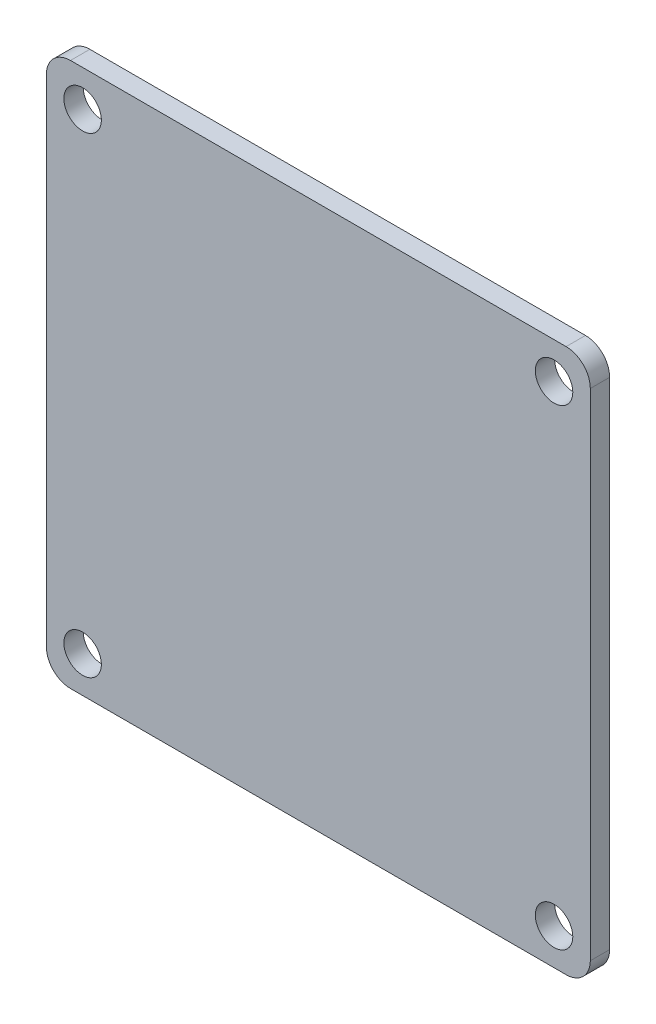
ISO-10303-21;
HEADER;
FILE_DESCRIPTION(('STEP AP214'),'2;1');
FILE_NAME('part.step','',(''),(''),'','','');
FILE_SCHEMA(('AUTOMOTIVE_DESIGN { 1 0 10303 214 1 1 1 1 }'));
ENDSEC;
DATA;
#1=APPLICATION_CONTEXT('core data for automotive mechanical design processes');
#2=APPLICATION_PROTOCOL_DEFINITION('international standard','automotive_design',2000,#1);
#3=PRODUCT_CONTEXT('',#1,'mechanical');
#4=PRODUCT('Part','Part','',(#3));
#5=PRODUCT_RELATED_PRODUCT_CATEGORY('part','',(#4));
#6=PRODUCT_DEFINITION_FORMATION('','',#4);
#7=PRODUCT_DEFINITION_CONTEXT('part definition',#1,'design');
#8=PRODUCT_DEFINITION('design','',#6,#7);
#9=PRODUCT_DEFINITION_SHAPE('','',#8);
#10=(LENGTH_UNIT() NAMED_UNIT(*) SI_UNIT(.MILLI.,.METRE.));
#11=(NAMED_UNIT(*) PLANE_ANGLE_UNIT() SI_UNIT($,.RADIAN.));
#12=(NAMED_UNIT(*) SI_UNIT($,.STERADIAN.) SOLID_ANGLE_UNIT());
#13=UNCERTAINTY_MEASURE_WITH_UNIT(LENGTH_MEASURE(1.E-05),#10,'distance_accuracy_value','');
#14=(GEOMETRIC_REPRESENTATION_CONTEXT(3) GLOBAL_UNCERTAINTY_ASSIGNED_CONTEXT((#13)) GLOBAL_UNIT_ASSIGNED_CONTEXT((#10,
#11,#12)) REPRESENTATION_CONTEXT('',''));
#15=CARTESIAN_POINT('',(0.,0.,0.));
#16=DIRECTION('',(0.,0.,1.));
#17=DIRECTION('',(1.,0.,0.));
#18=AXIS2_PLACEMENT_3D('',#15,#16,#17);
#19=CARTESIAN_POINT('',(0.,0.,1.6));
#20=DIRECTION('',(0.,0.,-1.));
#21=DIRECTION('',(-1.,0.,0.));
#22=AXIS2_PLACEMENT_3D('',#19,#20,#21);
#23=PLANE('',#22);
#24=DIRECTION('',(-1.,0.,0.));
#25=VECTOR('',#24,1.);
#26=CARTESIAN_POINT('',(0.,45.,1.6));
#27=LINE('',#26,#25);
#28=CARTESIAN_POINT('',(43.,45.,1.6));
#29=VERTEX_POINT('',#28);
#30=CARTESIAN_POINT('',(1.99999999999999,45.,1.6));
#31=VERTEX_POINT('',#30);
#32=EDGE_CURVE('E136',#29,#31,#27,.T.);
#33=ORIENTED_EDGE('',*,*,#32,.T.);
#34=CARTESIAN_POINT('',(1.99999999999999,43.,1.6));
#35=DIRECTION('',(0.,0.,-1.));
#36=DIRECTION('',(-1.,0.,0.));
#37=AXIS2_PLACEMENT_3D('',#34,#35,#36);
#38=CIRCLE('',#37,2.);
#39=CARTESIAN_POINT('',(0.,43.,1.6));
#40=VERTEX_POINT('',#39);
#41=EDGE_CURVE('E155',#31,#40,#38,.F.);
#42=ORIENTED_EDGE('',*,*,#41,.T.);
#43=DIRECTION('',(0.,-1.,0.));
#44=VECTOR('',#43,1.);
#45=CARTESIAN_POINT('',(0.,0.,1.6));
#46=LINE('',#45,#44);
#47=CARTESIAN_POINT('',(0.,2.,1.6));
#48=VERTEX_POINT('',#47);
#49=EDGE_CURVE('E119',#40,#48,#46,.T.);
#50=ORIENTED_EDGE('',*,*,#49,.T.);
#51=CARTESIAN_POINT('',(2.,2.,1.6));
#52=DIRECTION('',(0.,0.,-1.));
#53=DIRECTION('',(-1.,0.,0.));
#54=AXIS2_PLACEMENT_3D('',#51,#52,#53);
#55=CIRCLE('',#54,2.);
#56=CARTESIAN_POINT('',(2.,0.,1.6));
#57=VERTEX_POINT('',#56);
#58=EDGE_CURVE('E150',#48,#57,#55,.F.);
#59=ORIENTED_EDGE('',*,*,#58,.T.);
#60=DIRECTION('',(1.,0.,0.));
#61=VECTOR('',#60,1.);
#62=CARTESIAN_POINT('',(0.,0.,1.6));
#63=LINE('',#62,#61);
#64=CARTESIAN_POINT('',(43.,0.,1.6));
#65=VERTEX_POINT('',#64);
#66=EDGE_CURVE('E166',#57,#65,#63,.T.);
#67=ORIENTED_EDGE('',*,*,#66,.T.);
#68=CARTESIAN_POINT('',(43.,2.,1.6));
#69=DIRECTION('',(0.,0.,-1.));
#70=DIRECTION('',(-1.,0.,0.));
#71=AXIS2_PLACEMENT_3D('',#68,#69,#70);
#72=CIRCLE('',#71,2.);
#73=CARTESIAN_POINT('',(45.,2.,1.6));
#74=VERTEX_POINT('',#73);
#75=EDGE_CURVE('E55',#65,#74,#72,.F.);
#76=ORIENTED_EDGE('',*,*,#75,.T.);
#77=DIRECTION('',(0.,1.,0.));
#78=VECTOR('',#77,1.);
#79=CARTESIAN_POINT('',(45.,0.,1.6));
#80=LINE('',#79,#78);
#81=CARTESIAN_POINT('',(45.,43.,1.6));
#82=VERTEX_POINT('',#81);
#83=EDGE_CURVE('E174',#74,#82,#80,.T.);
#84=ORIENTED_EDGE('',*,*,#83,.T.);
#85=CARTESIAN_POINT('',(43.,43.,1.6));
#86=DIRECTION('',(0.,0.,-1.));
#87=DIRECTION('',(-1.,0.,0.));
#88=AXIS2_PLACEMENT_3D('',#85,#86,#87);
#89=CIRCLE('',#88,2.);
#90=EDGE_CURVE('E153',#82,#29,#89,.F.);
#91=ORIENTED_EDGE('',*,*,#90,.T.);
#92=EDGE_LOOP('',(#33,#42,#50,#59,#67,#76,#84,#91));
#93=FACE_BOUND('',#92,.T.);
#94=CARTESIAN_POINT('',(3.,42.,1.6));
#95=DIRECTION('',(0.,0.,1.));
#96=DIRECTION('',(1.,0.,0.));
#97=AXIS2_PLACEMENT_3D('',#94,#95,#96);
#98=CIRCLE('',#97,1.55000000000001);
#99=CARTESIAN_POINT('',(4.55000000000001,42.,1.6));
#100=VERTEX_POINT('',#99);
#101=EDGE_CURVE('E127',#100,#100,#98,.T.);
#102=ORIENTED_EDGE('',*,*,#101,.F.);
#103=EDGE_LOOP('',(#102));
#104=FACE_BOUND('',#103,.T.);
#105=CARTESIAN_POINT('',(42.,42.,1.6));
#106=DIRECTION('',(0.,0.,1.));
#107=DIRECTION('',(1.,0.,0.));
#108=AXIS2_PLACEMENT_3D('',#105,#106,#107);
#109=CIRCLE('',#108,1.55);
#110=CARTESIAN_POINT('',(43.55,42.,1.6));
#111=VERTEX_POINT('',#110);
#112=EDGE_CURVE('E181',#111,#111,#109,.T.);
#113=ORIENTED_EDGE('',*,*,#112,.F.);
#114=EDGE_LOOP('',(#113));
#115=FACE_BOUND('',#114,.T.);
#116=CARTESIAN_POINT('',(42.,3.,1.6));
#117=DIRECTION('',(0.,0.,1.));
#118=DIRECTION('',(1.,0.,0.));
#119=AXIS2_PLACEMENT_3D('',#116,#117,#118);
#120=CIRCLE('',#119,1.55);
#121=CARTESIAN_POINT('',(43.55,3.,1.6));
#122=VERTEX_POINT('',#121);
#123=EDGE_CURVE('E186',#122,#122,#120,.T.);
#124=ORIENTED_EDGE('',*,*,#123,.F.);
#125=EDGE_LOOP('',(#124));
#126=FACE_BOUND('',#125,.T.);
#127=CARTESIAN_POINT('',(3.,3.,1.6));
#128=DIRECTION('',(0.,0.,1.));
#129=DIRECTION('',(1.,0.,0.));
#130=AXIS2_PLACEMENT_3D('',#127,#128,#129);
#131=CIRCLE('',#130,1.55);
#132=CARTESIAN_POINT('',(4.55,3.,1.6));
#133=VERTEX_POINT('',#132);
#134=EDGE_CURVE('E192',#133,#133,#131,.T.);
#135=ORIENTED_EDGE('',*,*,#134,.F.);
#136=EDGE_LOOP('',(#135));
#137=FACE_BOUND('',#136,.T.);
#138=ADVANCED_FACE('F33',(#93,#104,#115,#126,#137),#23,.F.);
#139=CARTESIAN_POINT('',(0.,0.,0.));
#140=DIRECTION('',(0.,0.,-1.));
#141=DIRECTION('',(-1.,0.,0.));
#142=AXIS2_PLACEMENT_3D('',#139,#140,#141);
#143=PLANE('',#142);
#144=CARTESIAN_POINT('',(42.,3.,0.));
#145=DIRECTION('',(0.,0.,1.));
#146=DIRECTION('',(1.,0.,0.));
#147=AXIS2_PLACEMENT_3D('',#144,#145,#146);
#148=CIRCLE('',#147,1.55);
#149=CARTESIAN_POINT('',(43.55,3.,0.));
#150=VERTEX_POINT('',#149);
#151=EDGE_CURVE('E189',#150,#150,#148,.T.);
#152=ORIENTED_EDGE('',*,*,#151,.T.);
#153=EDGE_LOOP('',(#152));
#154=FACE_BOUND('',#153,.T.);
#155=CARTESIAN_POINT('',(3.,42.,0.));
#156=DIRECTION('',(0.,0.,1.));
#157=DIRECTION('',(1.,0.,0.));
#158=AXIS2_PLACEMENT_3D('',#155,#156,#157);
#159=CIRCLE('',#158,1.55000000000001);
#160=CARTESIAN_POINT('',(4.55000000000001,42.,0.));
#161=VERTEX_POINT('',#160);
#162=EDGE_CURVE('E133',#161,#161,#159,.T.);
#163=ORIENTED_EDGE('',*,*,#162,.T.);
#164=EDGE_LOOP('',(#163));
#165=FACE_BOUND('',#164,.T.);
#166=DIRECTION('',(0.,-1.,0.));
#167=VECTOR('',#166,1.);
#168=CARTESIAN_POINT('',(0.,0.,0.));
#169=LINE('',#168,#167);
#170=CARTESIAN_POINT('',(0.,43.,0.));
#171=VERTEX_POINT('',#170);
#172=CARTESIAN_POINT('',(0.,2.,0.));
#173=VERTEX_POINT('',#172);
#174=EDGE_CURVE('E116',#171,#173,#169,.T.);
#175=ORIENTED_EDGE('',*,*,#174,.F.);
#176=CARTESIAN_POINT('',(1.99999999999999,43.,0.));
#177=DIRECTION('',(0.,0.,-1.));
#178=DIRECTION('',(-1.,0.,0.));
#179=AXIS2_PLACEMENT_3D('',#176,#177,#178);
#180=CIRCLE('',#179,2.);
#181=CARTESIAN_POINT('',(1.99999999999999,45.,0.));
#182=VERTEX_POINT('',#181);
#183=EDGE_CURVE('E99',#171,#182,#180,.T.);
#184=ORIENTED_EDGE('',*,*,#183,.T.);
#185=DIRECTION('',(-1.,0.,0.));
#186=VECTOR('',#185,1.);
#187=CARTESIAN_POINT('',(0.,45.,0.));
#188=LINE('',#187,#186);
#189=CARTESIAN_POINT('',(43.,45.,0.));
#190=VERTEX_POINT('',#189);
#191=EDGE_CURVE('E140',#190,#182,#188,.T.);
#192=ORIENTED_EDGE('',*,*,#191,.F.);
#193=CARTESIAN_POINT('',(43.,43.,0.));
#194=DIRECTION('',(0.,0.,-1.));
#195=DIRECTION('',(-1.,0.,0.));
#196=AXIS2_PLACEMENT_3D('',#193,#194,#195);
#197=CIRCLE('',#196,2.);
#198=CARTESIAN_POINT('',(45.,43.,0.));
#199=VERTEX_POINT('',#198);
#200=EDGE_CURVE('E110',#190,#199,#197,.T.);
#201=ORIENTED_EDGE('',*,*,#200,.T.);
#202=DIRECTION('',(0.,1.,0.));
#203=VECTOR('',#202,1.);
#204=CARTESIAN_POINT('',(45.,0.,0.));
#205=LINE('',#204,#203);
#206=CARTESIAN_POINT('',(45.,2.,0.));
#207=VERTEX_POINT('',#206);
#208=EDGE_CURVE('E130',#207,#199,#205,.T.);
#209=ORIENTED_EDGE('',*,*,#208,.F.);
#210=CARTESIAN_POINT('',(43.,2.,0.));
#211=DIRECTION('',(0.,0.,-1.));
#212=DIRECTION('',(-1.,0.,0.));
#213=AXIS2_PLACEMENT_3D('',#210,#211,#212);
#214=CIRCLE('',#213,2.);
#215=CARTESIAN_POINT('',(43.,0.,0.));
#216=VERTEX_POINT('',#215);
#217=EDGE_CURVE('E144',#207,#216,#214,.T.);
#218=ORIENTED_EDGE('',*,*,#217,.T.);
#219=DIRECTION('',(1.,0.,0.));
#220=VECTOR('',#219,1.);
#221=CARTESIAN_POINT('',(0.,0.,0.));
#222=LINE('',#221,#220);
#223=CARTESIAN_POINT('',(2.,0.,0.));
#224=VERTEX_POINT('',#223);
#225=EDGE_CURVE('E126',#224,#216,#222,.T.);
#226=ORIENTED_EDGE('',*,*,#225,.F.);
#227=CARTESIAN_POINT('',(2.,2.,0.));
#228=DIRECTION('',(0.,0.,-1.));
#229=DIRECTION('',(-1.,0.,0.));
#230=AXIS2_PLACEMENT_3D('',#227,#228,#229);
#231=CIRCLE('',#230,2.);
#232=EDGE_CURVE('E120',#224,#173,#231,.T.);
#233=ORIENTED_EDGE('',*,*,#232,.T.);
#234=EDGE_LOOP('',(#175,#184,#192,#201,#209,#218,#226,#233));
#235=FACE_BOUND('',#234,.T.);
#236=CARTESIAN_POINT('',(42.,42.,0.));
#237=DIRECTION('',(0.,0.,1.));
#238=DIRECTION('',(1.,0.,0.));
#239=AXIS2_PLACEMENT_3D('',#236,#237,#238);
#240=CIRCLE('',#239,1.55);
#241=CARTESIAN_POINT('',(43.55,42.,0.));
#242=VERTEX_POINT('',#241);
#243=EDGE_CURVE('E183',#242,#242,#240,.T.);
#244=ORIENTED_EDGE('',*,*,#243,.T.);
#245=EDGE_LOOP('',(#244));
#246=FACE_BOUND('',#245,.T.);
#247=CARTESIAN_POINT('',(3.,3.,0.));
#248=DIRECTION('',(0.,0.,1.));
#249=DIRECTION('',(1.,0.,0.));
#250=AXIS2_PLACEMENT_3D('',#247,#248,#249);
#251=CIRCLE('',#250,1.55);
#252=CARTESIAN_POINT('',(4.55,3.,0.));
#253=VERTEX_POINT('',#252);
#254=EDGE_CURVE('E195',#253,#253,#251,.T.);
#255=ORIENTED_EDGE('',*,*,#254,.T.);
#256=EDGE_LOOP('',(#255));
#257=FACE_BOUND('',#256,.T.);
#258=ADVANCED_FACE('F123',(#154,#165,#235,#246,#257),#143,.T.);
#259=CARTESIAN_POINT('',(0.,0.,1.6));
#260=DIRECTION('',(1.,0.,0.));
#261=DIRECTION('',(0.,1.,0.));
#262=AXIS2_PLACEMENT_3D('',#259,#260,#261);
#263=PLANE('',#262);
#264=ORIENTED_EDGE('',*,*,#49,.F.);
#265=DIRECTION('',(0.,0.,-1.));
#266=VECTOR('',#265,1.);
#267=CARTESIAN_POINT('',(0.,43.,1.6));
#268=LINE('',#267,#266);
#269=EDGE_CURVE('E103',#40,#171,#268,.T.);
#270=ORIENTED_EDGE('',*,*,#269,.T.);
#271=ORIENTED_EDGE('',*,*,#174,.T.);
#272=DIRECTION('',(0.,0.,-1.));
#273=VECTOR('',#272,1.);
#274=CARTESIAN_POINT('',(0.,2.,1.6));
#275=LINE('',#274,#273);
#276=EDGE_CURVE('E121',#173,#48,#275,.F.);
#277=ORIENTED_EDGE('',*,*,#276,.T.);
#278=EDGE_LOOP('',(#264,#270,#271,#277));
#279=FACE_BOUND('',#278,.T.);
#280=ADVANCED_FACE('F115',(#279),#263,.F.);
#281=CARTESIAN_POINT('',(0.,0.,1.6));
#282=DIRECTION('',(0.,1.,0.));
#283=DIRECTION('',(0.,0.,1.));
#284=AXIS2_PLACEMENT_3D('',#281,#282,#283);
#285=PLANE('',#284);
#286=ORIENTED_EDGE('',*,*,#225,.T.);
#287=DIRECTION('',(0.,0.,-1.));
#288=VECTOR('',#287,1.);
#289=CARTESIAN_POINT('',(43.,0.,1.6));
#290=LINE('',#289,#288);
#291=EDGE_CURVE('E11',#216,#65,#290,.F.);
#292=ORIENTED_EDGE('',*,*,#291,.T.);
#293=ORIENTED_EDGE('',*,*,#66,.F.);
#294=DIRECTION('',(0.,0.,-1.));
#295=VECTOR('',#294,1.);
#296=CARTESIAN_POINT('',(2.,0.,1.6));
#297=LINE('',#296,#295);
#298=EDGE_CURVE('E41',#57,#224,#297,.T.);
#299=ORIENTED_EDGE('',*,*,#298,.T.);
#300=EDGE_LOOP('',(#286,#292,#293,#299));
#301=FACE_BOUND('',#300,.T.);
#302=ADVANCED_FACE('F164',(#301),#285,.F.);
#303=CARTESIAN_POINT('',(45.,0.,1.6));
#304=DIRECTION('',(-1.,0.,0.));
#305=DIRECTION('',(0.,-1.,0.));
#306=AXIS2_PLACEMENT_3D('',#303,#304,#305);
#307=PLANE('',#306);
#308=ORIENTED_EDGE('',*,*,#208,.T.);
#309=DIRECTION('',(0.,0.,-1.));
#310=VECTOR('',#309,1.);
#311=CARTESIAN_POINT('',(45.,43.,1.6));
#312=LINE('',#311,#310);
#313=EDGE_CURVE('E48',#199,#82,#312,.F.);
#314=ORIENTED_EDGE('',*,*,#313,.T.);
#315=ORIENTED_EDGE('',*,*,#83,.F.);
#316=DIRECTION('',(0.,0.,-1.));
#317=VECTOR('',#316,1.);
#318=CARTESIAN_POINT('',(45.,2.,1.6));
#319=LINE('',#318,#317);
#320=EDGE_CURVE('E157',#74,#207,#319,.T.);
#321=ORIENTED_EDGE('',*,*,#320,.T.);
#322=EDGE_LOOP('',(#308,#314,#315,#321));
#323=FACE_BOUND('',#322,.T.);
#324=ADVANCED_FACE('F173',(#323),#307,.F.);
#325=CARTESIAN_POINT('',(0.,45.,1.6));
#326=DIRECTION('',(0.,-1.,0.));
#327=DIRECTION('',(0.,0.,-1.));
#328=AXIS2_PLACEMENT_3D('',#325,#326,#327);
#329=PLANE('',#328);
#330=ORIENTED_EDGE('',*,*,#191,.T.);
#331=DIRECTION('',(0.,0.,-1.));
#332=VECTOR('',#331,1.);
#333=CARTESIAN_POINT('',(1.99999999999999,45.,1.6));
#334=LINE('',#333,#332);
#335=EDGE_CURVE('E104',#182,#31,#334,.F.);
#336=ORIENTED_EDGE('',*,*,#335,.T.);
#337=ORIENTED_EDGE('',*,*,#32,.F.);
#338=DIRECTION('',(0.,0.,-1.));
#339=VECTOR('',#338,1.);
#340=CARTESIAN_POINT('',(43.,45.,1.6));
#341=LINE('',#340,#339);
#342=EDGE_CURVE('E109',#29,#190,#341,.T.);
#343=ORIENTED_EDGE('',*,*,#342,.T.);
#344=EDGE_LOOP('',(#330,#336,#337,#343));
#345=FACE_BOUND('',#344,.T.);
#346=ADVANCED_FACE('F216',(#345),#329,.F.);
#347=CARTESIAN_POINT('',(3.,42.,1.6));
#348=DIRECTION('',(0.,0.,-1.));
#349=DIRECTION('',(-1.,0.,0.));
#350=AXIS2_PLACEMENT_3D('',#347,#348,#349);
#351=CYLINDRICAL_SURFACE('',#350,1.55000000000001);
#352=ORIENTED_EDGE('',*,*,#101,.T.);
#353=EDGE_LOOP('',(#352));
#354=FACE_BOUND('',#353,.T.);
#355=ORIENTED_EDGE('',*,*,#162,.F.);
#356=EDGE_LOOP('',(#355));
#357=FACE_BOUND('',#356,.T.);
#358=ADVANCED_FACE('F213',(#354,#357),#351,.F.);
#359=CARTESIAN_POINT('',(42.,42.,1.6));
#360=DIRECTION('',(0.,0.,-1.));
#361=DIRECTION('',(-1.,0.,0.));
#362=AXIS2_PLACEMENT_3D('',#359,#360,#361);
#363=CYLINDRICAL_SURFACE('',#362,1.55);
#364=ORIENTED_EDGE('',*,*,#112,.T.);
#365=EDGE_LOOP('',(#364));
#366=FACE_BOUND('',#365,.T.);
#367=ORIENTED_EDGE('',*,*,#243,.F.);
#368=EDGE_LOOP('',(#367));
#369=FACE_BOUND('',#368,.T.);
#370=ADVANCED_FACE('F309',(#366,#369),#363,.F.);
#371=CARTESIAN_POINT('',(42.,3.,1.6));
#372=DIRECTION('',(0.,0.,-1.));
#373=DIRECTION('',(-1.,0.,0.));
#374=AXIS2_PLACEMENT_3D('',#371,#372,#373);
#375=CYLINDRICAL_SURFACE('',#374,1.55);
#376=ORIENTED_EDGE('',*,*,#123,.T.);
#377=EDGE_LOOP('',(#376));
#378=FACE_BOUND('',#377,.T.);
#379=ORIENTED_EDGE('',*,*,#151,.F.);
#380=EDGE_LOOP('',(#379));
#381=FACE_BOUND('',#380,.T.);
#382=ADVANCED_FACE('F300',(#378,#381),#375,.F.);
#383=CARTESIAN_POINT('',(3.,3.,1.6));
#384=DIRECTION('',(0.,0.,-1.));
#385=DIRECTION('',(-1.,0.,0.));
#386=AXIS2_PLACEMENT_3D('',#383,#384,#385);
#387=CYLINDRICAL_SURFACE('',#386,1.55);
#388=ORIENTED_EDGE('',*,*,#134,.T.);
#389=EDGE_LOOP('',(#388));
#390=FACE_BOUND('',#389,.T.);
#391=ORIENTED_EDGE('',*,*,#254,.F.);
#392=EDGE_LOOP('',(#391));
#393=FACE_BOUND('',#392,.T.);
#394=ADVANCED_FACE('F201',(#390,#393),#387,.F.);
#395=CARTESIAN_POINT('',(1.99999999999999,43.,1.6));
#396=DIRECTION('',(0.,0.,-1.));
#397=DIRECTION('',(-1.,0.,0.));
#398=AXIS2_PLACEMENT_3D('',#395,#396,#397);
#399=CYLINDRICAL_SURFACE('',#398,2.);
#400=ORIENTED_EDGE('',*,*,#41,.F.);
#401=ORIENTED_EDGE('',*,*,#335,.F.);
#402=ORIENTED_EDGE('',*,*,#183,.F.);
#403=ORIENTED_EDGE('',*,*,#269,.F.);
#404=EDGE_LOOP('',(#400,#401,#402,#403));
#405=FACE_BOUND('',#404,.T.);
#406=ADVANCED_FACE('F102',(#405),#399,.T.);
#407=CARTESIAN_POINT('',(43.,43.,1.6));
#408=DIRECTION('',(0.,0.,-1.));
#409=DIRECTION('',(-1.,0.,0.));
#410=AXIS2_PLACEMENT_3D('',#407,#408,#409);
#411=CYLINDRICAL_SURFACE('',#410,2.);
#412=ORIENTED_EDGE('',*,*,#90,.F.);
#413=ORIENTED_EDGE('',*,*,#313,.F.);
#414=ORIENTED_EDGE('',*,*,#200,.F.);
#415=ORIENTED_EDGE('',*,*,#342,.F.);
#416=EDGE_LOOP('',(#412,#413,#414,#415));
#417=FACE_BOUND('',#416,.T.);
#418=ADVANCED_FACE('F228',(#417),#411,.T.);
#419=CARTESIAN_POINT('',(43.,2.,1.6));
#420=DIRECTION('',(0.,0.,-1.));
#421=DIRECTION('',(-1.,0.,0.));
#422=AXIS2_PLACEMENT_3D('',#419,#420,#421);
#423=CYLINDRICAL_SURFACE('',#422,2.);
#424=ORIENTED_EDGE('',*,*,#75,.F.);
#425=ORIENTED_EDGE('',*,*,#291,.F.);
#426=ORIENTED_EDGE('',*,*,#217,.F.);
#427=ORIENTED_EDGE('',*,*,#320,.F.);
#428=EDGE_LOOP('',(#424,#425,#426,#427));
#429=FACE_BOUND('',#428,.T.);
#430=ADVANCED_FACE('F172',(#429),#423,.T.);
#431=CARTESIAN_POINT('',(2.,2.,1.6));
#432=DIRECTION('',(0.,0.,-1.));
#433=DIRECTION('',(-1.,0.,0.));
#434=AXIS2_PLACEMENT_3D('',#431,#432,#433);
#435=CYLINDRICAL_SURFACE('',#434,2.);
#436=ORIENTED_EDGE('',*,*,#58,.F.);
#437=ORIENTED_EDGE('',*,*,#276,.F.);
#438=ORIENTED_EDGE('',*,*,#232,.F.);
#439=ORIENTED_EDGE('',*,*,#298,.F.);
#440=EDGE_LOOP('',(#436,#437,#438,#439));
#441=FACE_BOUND('',#440,.T.);
#442=ADVANCED_FACE('F35',(#441),#435,.T.);
#443=CLOSED_SHELL('',(#138,#258,#280,#302,#324,#346,#358,#370,#382,#394,#406,#418,#430,#442));
#444=MANIFOLD_SOLID_BREP('B2',#443);
#445=ADVANCED_BREP_SHAPE_REPRESENTATION('',(#18,#444),#14);
#446=SHAPE_DEFINITION_REPRESENTATION(#9,#445);
ENDSEC;
END-ISO-10303-21;
